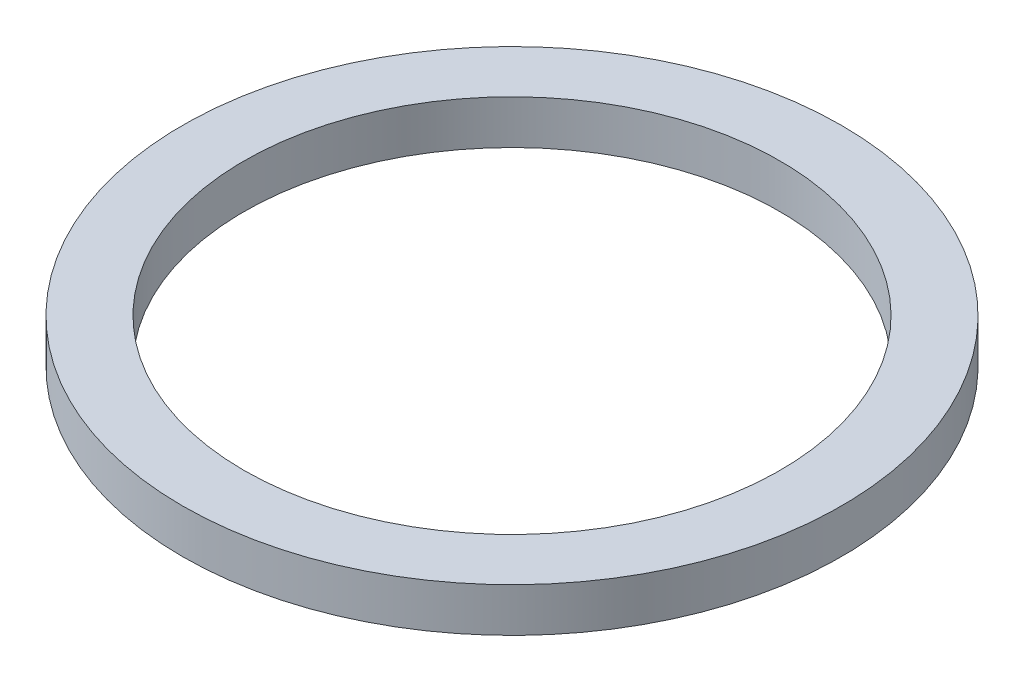
ISO-10303-21;
HEADER;
FILE_DESCRIPTION(('STEP AP214'),'2;1');
FILE_NAME('part.step','',(''),(''),'','','');
FILE_SCHEMA(('AUTOMOTIVE_DESIGN { 1 0 10303 214 1 1 1 1 }'));
ENDSEC;
DATA;
#1=APPLICATION_CONTEXT('core data for automotive mechanical design processes');
#2=APPLICATION_PROTOCOL_DEFINITION('international standard','automotive_design',2000,#1);
#3=PRODUCT_CONTEXT('',#1,'mechanical');
#4=PRODUCT('Part','Part','',(#3));
#5=PRODUCT_RELATED_PRODUCT_CATEGORY('part','',(#4));
#6=PRODUCT_DEFINITION_FORMATION('','',#4);
#7=PRODUCT_DEFINITION_CONTEXT('part definition',#1,'design');
#8=PRODUCT_DEFINITION('design','',#6,#7);
#9=PRODUCT_DEFINITION_SHAPE('','',#8);
#10=(LENGTH_UNIT() NAMED_UNIT(*) SI_UNIT(.MILLI.,.METRE.));
#11=(NAMED_UNIT(*) PLANE_ANGLE_UNIT() SI_UNIT($,.RADIAN.));
#12=(NAMED_UNIT(*) SI_UNIT($,.STERADIAN.) SOLID_ANGLE_UNIT());
#13=UNCERTAINTY_MEASURE_WITH_UNIT(LENGTH_MEASURE(1.E-05),#10,'distance_accuracy_value','');
#14=(GEOMETRIC_REPRESENTATION_CONTEXT(3) GLOBAL_UNCERTAINTY_ASSIGNED_CONTEXT((#13)) GLOBAL_UNIT_ASSIGNED_CONTEXT((#10,
#11,#12)) REPRESENTATION_CONTEXT('',''));
#15=CARTESIAN_POINT('',(0.,0.,0.));
#16=DIRECTION('',(0.,0.,1.));
#17=DIRECTION('',(1.,0.,0.));
#18=AXIS2_PLACEMENT_3D('',#15,#16,#17);
#19=CARTESIAN_POINT('',(-7.5,0.,0.));
#20=DIRECTION('',(0.,-1.,0.));
#21=DIRECTION('',(0.,0.,-1.));
#22=AXIS2_PLACEMENT_3D('',#19,#20,#21);
#23=PLANE('',#22);
#24=CARTESIAN_POINT('',(0.,0.,0.));
#25=DIRECTION('',(0.,1.,0.));
#26=DIRECTION('',(0.,0.,1.));
#27=AXIS2_PLACEMENT_3D('',#24,#25,#26);
#28=CIRCLE('',#27,7.5);
#29=CARTESIAN_POINT('',(0.,0.,7.5));
#30=VERTEX_POINT('',#29);
#31=EDGE_CURVE('E17',#30,#30,#28,.T.);
#32=ORIENTED_EDGE('',*,*,#31,.F.);
#33=EDGE_LOOP('',(#32));
#34=FACE_BOUND('',#33,.T.);
#35=CARTESIAN_POINT('',(0.,0.,0.));
#36=DIRECTION('',(0.,1.,0.));
#37=DIRECTION('',(0.,0.,1.));
#38=AXIS2_PLACEMENT_3D('',#35,#36,#37);
#39=CIRCLE('',#38,6.1);
#40=CARTESIAN_POINT('',(0.,0.,6.1));
#41=VERTEX_POINT('',#40);
#42=EDGE_CURVE('E26',#41,#41,#39,.T.);
#43=ORIENTED_EDGE('',*,*,#42,.T.);
#44=EDGE_LOOP('',(#43));
#45=FACE_BOUND('',#44,.T.);
#46=ADVANCED_FACE('F14',(#34,#45),#23,.T.);
#47=CARTESIAN_POINT('',(0.,0.,0.));
#48=DIRECTION('',(0.,1.,0.));
#49=DIRECTION('',(0.,0.,1.));
#50=AXIS2_PLACEMENT_3D('',#47,#48,#49);
#51=CYLINDRICAL_SURFACE('',#50,7.5);
#52=ORIENTED_EDGE('',*,*,#31,.T.);
#53=EDGE_LOOP('',(#52));
#54=FACE_BOUND('',#53,.T.);
#55=CARTESIAN_POINT('',(0.,1.,0.));
#56=DIRECTION('',(0.,1.,0.));
#57=DIRECTION('',(0.,0.,1.));
#58=AXIS2_PLACEMENT_3D('',#55,#56,#57);
#59=CIRCLE('',#58,7.5);
#60=CARTESIAN_POINT('',(0.,1.,7.5));
#61=VERTEX_POINT('',#60);
#62=EDGE_CURVE('E21',#61,#61,#59,.T.);
#63=ORIENTED_EDGE('',*,*,#62,.F.);
#64=EDGE_LOOP('',(#63));
#65=FACE_BOUND('',#64,.T.);
#66=ADVANCED_FACE('F34',(#54,#65),#51,.T.);
#67=CARTESIAN_POINT('',(0.,0.,0.));
#68=DIRECTION('',(0.,1.,0.));
#69=DIRECTION('',(0.,0.,1.));
#70=AXIS2_PLACEMENT_3D('',#67,#68,#69);
#71=CYLINDRICAL_SURFACE('',#70,6.1);
#72=CARTESIAN_POINT('',(0.,1.,0.));
#73=DIRECTION('',(0.,1.,0.));
#74=DIRECTION('',(0.,0.,1.));
#75=AXIS2_PLACEMENT_3D('',#72,#73,#74);
#76=CIRCLE('',#75,6.1);
#77=CARTESIAN_POINT('',(0.,1.,6.1));
#78=VERTEX_POINT('',#77);
#79=EDGE_CURVE('E10',#78,#78,#76,.F.);
#80=ORIENTED_EDGE('',*,*,#79,.F.);
#81=EDGE_LOOP('',(#80));
#82=FACE_BOUND('',#81,.T.);
#83=ORIENTED_EDGE('',*,*,#42,.F.);
#84=EDGE_LOOP('',(#83));
#85=FACE_BOUND('',#84,.T.);
#86=ADVANCED_FACE('F42',(#82,#85),#71,.F.);
#87=CARTESIAN_POINT('',(-7.5,1.,0.));
#88=DIRECTION('',(0.,1.,0.));
#89=DIRECTION('',(0.,0.,1.));
#90=AXIS2_PLACEMENT_3D('',#87,#88,#89);
#91=PLANE('',#90);
#92=ORIENTED_EDGE('',*,*,#79,.T.);
#93=EDGE_LOOP('',(#92));
#94=FACE_BOUND('',#93,.T.);
#95=ORIENTED_EDGE('',*,*,#62,.T.);
#96=EDGE_LOOP('',(#95));
#97=FACE_BOUND('',#96,.T.);
#98=ADVANCED_FACE('F43',(#94,#97),#91,.T.);
#99=CLOSED_SHELL('',(#46,#66,#86,#98));
#100=MANIFOLD_SOLID_BREP('B1',#99);
#101=ADVANCED_BREP_SHAPE_REPRESENTATION('',(#18,#100),#14);
#102=SHAPE_DEFINITION_REPRESENTATION(#9,#101);
ENDSEC;
END-ISO-10303-21;
